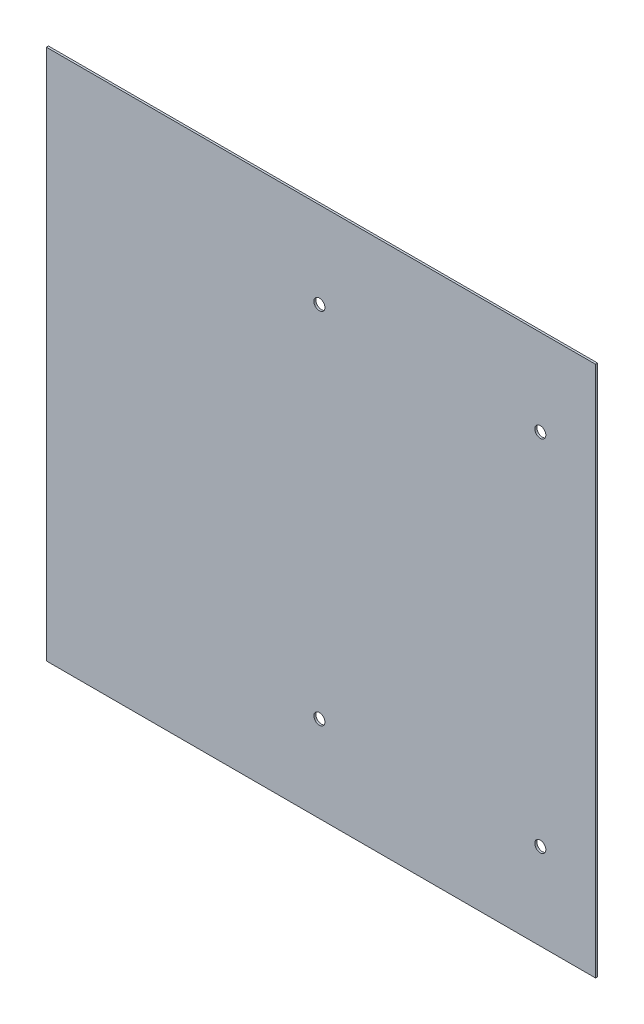
ISO-10303-21;
HEADER;
FILE_DESCRIPTION(('STEP AP214'),'2;1');
FILE_NAME('part.step','',(''),(''),'','','');
FILE_SCHEMA(('AUTOMOTIVE_DESIGN { 1 0 10303 214 1 1 1 1 }'));
ENDSEC;
DATA;
#1=APPLICATION_CONTEXT('core data for automotive mechanical design processes');
#2=APPLICATION_PROTOCOL_DEFINITION('international standard','automotive_design',2000,#1);
#3=PRODUCT_CONTEXT('',#1,'mechanical');
#4=PRODUCT('Part','Part','',(#3));
#5=PRODUCT_RELATED_PRODUCT_CATEGORY('part','',(#4));
#6=PRODUCT_DEFINITION_FORMATION('','',#4);
#7=PRODUCT_DEFINITION_CONTEXT('part definition',#1,'design');
#8=PRODUCT_DEFINITION('design','',#6,#7);
#9=PRODUCT_DEFINITION_SHAPE('','',#8);
#10=(LENGTH_UNIT() NAMED_UNIT(*) SI_UNIT(.MILLI.,.METRE.));
#11=(NAMED_UNIT(*) PLANE_ANGLE_UNIT() SI_UNIT($,.RADIAN.));
#12=(NAMED_UNIT(*) SI_UNIT($,.STERADIAN.) SOLID_ANGLE_UNIT());
#13=UNCERTAINTY_MEASURE_WITH_UNIT(LENGTH_MEASURE(1.E-05),#10,'distance_accuracy_value','');
#14=(GEOMETRIC_REPRESENTATION_CONTEXT(3) GLOBAL_UNCERTAINTY_ASSIGNED_CONTEXT((#13)) GLOBAL_UNIT_ASSIGNED_CONTEXT((#10,
#11,#12)) REPRESENTATION_CONTEXT('',''));
#15=CARTESIAN_POINT('',(0.,0.,0.));
#16=DIRECTION('',(0.,0.,1.));
#17=DIRECTION('',(1.,0.,0.));
#18=AXIS2_PLACEMENT_3D('',#15,#16,#17);
#19=CARTESIAN_POINT('',(231.071313833518,0.,1.5));
#20=DIRECTION('',(1.,0.,0.));
#21=DIRECTION('',(0.,0.,-1.));
#22=AXIS2_PLACEMENT_3D('',#19,#20,#21);
#23=PLANE('',#22);
#24=DIRECTION('',(0.,-1.,0.));
#25=VECTOR('',#24,1.);
#26=CARTESIAN_POINT('',(231.071313833518,0.,0.));
#27=LINE('',#26,#25);
#28=CARTESIAN_POINT('',(231.071313833518,0.,0.));
#29=VERTEX_POINT('',#28);
#30=CARTESIAN_POINT('',(231.071313833518,-385.,0.));
#31=VERTEX_POINT('',#30);
#32=EDGE_CURVE('E95',#29,#31,#27,.T.);
#33=ORIENTED_EDGE('',*,*,#32,.T.);
#34=DIRECTION('',(0.,0.,-1.));
#35=VECTOR('',#34,1.);
#36=CARTESIAN_POINT('',(231.071313833518,-385.,1.5));
#37=LINE('',#36,#35);
#38=CARTESIAN_POINT('',(231.071313833518,-385.,1.5));
#39=VERTEX_POINT('',#38);
#40=EDGE_CURVE('E11',#39,#31,#37,.T.);
#41=ORIENTED_EDGE('',*,*,#40,.F.);
#42=DIRECTION('',(0.,-1.,0.));
#43=VECTOR('',#42,1.);
#44=CARTESIAN_POINT('',(231.071313833518,0.,1.5));
#45=LINE('',#44,#43);
#46=CARTESIAN_POINT('',(231.071313833518,0.,1.5));
#47=VERTEX_POINT('',#46);
#48=EDGE_CURVE('E83',#47,#39,#45,.T.);
#49=ORIENTED_EDGE('',*,*,#48,.F.);
#50=DIRECTION('',(0.,0.,-1.));
#51=VECTOR('',#50,1.);
#52=CARTESIAN_POINT('',(231.071313833518,0.,1.5));
#53=LINE('',#52,#51);
#54=EDGE_CURVE('E91',#47,#29,#53,.T.);
#55=ORIENTED_EDGE('',*,*,#54,.T.);
#56=EDGE_LOOP('',(#33,#41,#49,#55));
#57=FACE_BOUND('',#56,.T.);
#58=ADVANCED_FACE('F32',(#57),#23,.F.);
#59=CARTESIAN_POINT('',(231.071313833518,-385.,1.5));
#60=DIRECTION('',(0.,1.,0.));
#61=DIRECTION('',(0.,0.,1.));
#62=AXIS2_PLACEMENT_3D('',#59,#60,#61);
#63=PLANE('',#62);
#64=DIRECTION('',(1.,0.,0.));
#65=VECTOR('',#64,1.);
#66=CARTESIAN_POINT('',(231.071313833518,-385.,0.));
#67=LINE('',#66,#65);
#68=CARTESIAN_POINT('',(628.8,-385.,0.));
#69=VERTEX_POINT('',#68);
#70=EDGE_CURVE('E87',#31,#69,#67,.T.);
#71=ORIENTED_EDGE('',*,*,#70,.T.);
#72=DIRECTION('',(0.,0.,-1.));
#73=VECTOR('',#72,1.);
#74=CARTESIAN_POINT('',(628.8,-385.,1.5));
#75=LINE('',#74,#73);
#76=CARTESIAN_POINT('',(628.8,-385.,1.5));
#77=VERTEX_POINT('',#76);
#78=EDGE_CURVE('E40',#77,#69,#75,.T.);
#79=ORIENTED_EDGE('',*,*,#78,.F.);
#80=DIRECTION('',(1.,0.,0.));
#81=VECTOR('',#80,1.);
#82=CARTESIAN_POINT('',(231.071313833518,-385.,1.5));
#83=LINE('',#82,#81);
#84=EDGE_CURVE('E78',#39,#77,#83,.T.);
#85=ORIENTED_EDGE('',*,*,#84,.F.);
#86=ORIENTED_EDGE('',*,*,#40,.T.);
#87=EDGE_LOOP('',(#71,#79,#85,#86));
#88=FACE_BOUND('',#87,.T.);
#89=ADVANCED_FACE('F86',(#88),#63,.F.);
#90=CARTESIAN_POINT('',(628.8,0.,1.5));
#91=DIRECTION('',(-1.,0.,0.));
#92=DIRECTION('',(0.,0.,1.));
#93=AXIS2_PLACEMENT_3D('',#90,#91,#92);
#94=PLANE('',#93);
#95=DIRECTION('',(0.,1.,0.));
#96=VECTOR('',#95,1.);
#97=CARTESIAN_POINT('',(628.8,0.,0.));
#98=LINE('',#97,#96);
#99=CARTESIAN_POINT('',(628.8,0.,0.));
#100=VERTEX_POINT('',#99);
#101=EDGE_CURVE('E65',#69,#100,#98,.T.);
#102=ORIENTED_EDGE('',*,*,#101,.T.);
#103=DIRECTION('',(0.,0.,-1.));
#104=VECTOR('',#103,1.);
#105=CARTESIAN_POINT('',(628.8,0.,1.5));
#106=LINE('',#105,#104);
#107=CARTESIAN_POINT('',(628.8,0.,1.5));
#108=VERTEX_POINT('',#107);
#109=EDGE_CURVE('E88',#108,#100,#106,.T.);
#110=ORIENTED_EDGE('',*,*,#109,.F.);
#111=DIRECTION('',(0.,1.,0.));
#112=VECTOR('',#111,1.);
#113=CARTESIAN_POINT('',(628.8,0.,1.5));
#114=LINE('',#113,#112);
#115=EDGE_CURVE('E81',#77,#108,#114,.T.);
#116=ORIENTED_EDGE('',*,*,#115,.F.);
#117=ORIENTED_EDGE('',*,*,#78,.T.);
#118=EDGE_LOOP('',(#102,#110,#116,#117));
#119=FACE_BOUND('',#118,.T.);
#120=ADVANCED_FACE('F89',(#119),#94,.F.);
#121=CARTESIAN_POINT('',(231.071313833518,0.,1.5));
#122=DIRECTION('',(0.,-1.,0.));
#123=DIRECTION('',(0.,0.,-1.));
#124=AXIS2_PLACEMENT_3D('',#121,#122,#123);
#125=PLANE('',#124);
#126=DIRECTION('',(-1.,0.,0.));
#127=VECTOR('',#126,1.);
#128=CARTESIAN_POINT('',(231.071313833518,0.,0.));
#129=LINE('',#128,#127);
#130=EDGE_CURVE('E71',#100,#29,#129,.T.);
#131=ORIENTED_EDGE('',*,*,#130,.T.);
#132=ORIENTED_EDGE('',*,*,#54,.F.);
#133=DIRECTION('',(-1.,0.,0.));
#134=VECTOR('',#133,1.);
#135=CARTESIAN_POINT('',(231.071313833518,0.,1.5));
#136=LINE('',#135,#134);
#137=EDGE_CURVE('E48',#108,#47,#136,.T.);
#138=ORIENTED_EDGE('',*,*,#137,.F.);
#139=ORIENTED_EDGE('',*,*,#109,.T.);
#140=EDGE_LOOP('',(#131,#132,#138,#139));
#141=FACE_BOUND('',#140,.T.);
#142=ADVANCED_FACE('F103',(#141),#125,.F.);
#143=CARTESIAN_POINT('',(0.,0.,1.5));
#144=DIRECTION('',(0.,0.,1.));
#145=DIRECTION('',(1.,0.,0.));
#146=AXIS2_PLACEMENT_3D('',#143,#144,#145);
#147=PLANE('',#146);
#148=CARTESIAN_POINT('',(588.8,-322.5,1.5));
#149=DIRECTION('',(0.,0.,1.));
#150=DIRECTION('',(-1.,0.,0.));
#151=AXIS2_PLACEMENT_3D('',#148,#149,#150);
#152=CIRCLE('',#151,3.99999999999999);
#153=CARTESIAN_POINT('',(584.8,-322.5,1.5));
#154=VERTEX_POINT('',#153);
#155=EDGE_CURVE('E122',#154,#154,#152,.T.);
#156=ORIENTED_EDGE('',*,*,#155,.F.);
#157=EDGE_LOOP('',(#156));
#158=FACE_BOUND('',#157,.T.);
#159=CARTESIAN_POINT('',(428.8,-62.5000000000002,1.5));
#160=DIRECTION('',(0.,0.,1.));
#161=DIRECTION('',(-1.,0.,0.));
#162=AXIS2_PLACEMENT_3D('',#159,#160,#161);
#163=CIRCLE('',#162,4.0000000000001);
#164=CARTESIAN_POINT('',(424.8,-62.5000000000002,1.5));
#165=VERTEX_POINT('',#164);
#166=EDGE_CURVE('E115',#165,#165,#163,.T.);
#167=ORIENTED_EDGE('',*,*,#166,.F.);
#168=EDGE_LOOP('',(#167));
#169=FACE_BOUND('',#168,.T.);
#170=CARTESIAN_POINT('',(428.8,-322.5,1.5));
#171=DIRECTION('',(0.,0.,1.));
#172=DIRECTION('',(1.,0.,0.));
#173=AXIS2_PLACEMENT_3D('',#170,#171,#172);
#174=CIRCLE('',#173,4.0000000000001);
#175=CARTESIAN_POINT('',(432.8,-322.5,1.5));
#176=VERTEX_POINT('',#175);
#177=EDGE_CURVE('E127',#176,#176,#174,.T.);
#178=ORIENTED_EDGE('',*,*,#177,.F.);
#179=EDGE_LOOP('',(#178));
#180=FACE_BOUND('',#179,.T.);
#181=CARTESIAN_POINT('',(588.8,-62.5000000000002,1.5));
#182=DIRECTION('',(0.,0.,1.));
#183=DIRECTION('',(1.,0.,0.));
#184=AXIS2_PLACEMENT_3D('',#181,#182,#183);
#185=CIRCLE('',#184,3.99999999999999);
#186=CARTESIAN_POINT('',(592.8,-62.5000000000002,1.5));
#187=VERTEX_POINT('',#186);
#188=EDGE_CURVE('E109',#187,#187,#185,.T.);
#189=ORIENTED_EDGE('',*,*,#188,.F.);
#190=EDGE_LOOP('',(#189));
#191=FACE_BOUND('',#190,.T.);
#192=ORIENTED_EDGE('',*,*,#48,.T.);
#193=ORIENTED_EDGE('',*,*,#84,.T.);
#194=ORIENTED_EDGE('',*,*,#115,.T.);
#195=ORIENTED_EDGE('',*,*,#137,.T.);
#196=EDGE_LOOP('',(#192,#193,#194,#195));
#197=FACE_BOUND('',#196,.T.);
#198=ADVANCED_FACE('F79',(#158,#169,#180,#191,#197),#147,.T.);
#199=CARTESIAN_POINT('',(0.,0.,0.));
#200=DIRECTION('',(0.,0.,1.));
#201=DIRECTION('',(1.,0.,0.));
#202=AXIS2_PLACEMENT_3D('',#199,#200,#201);
#203=PLANE('',#202);
#204=CARTESIAN_POINT('',(588.8,-322.5,0.));
#205=DIRECTION('',(0.,0.,1.));
#206=DIRECTION('',(-1.,0.,0.));
#207=AXIS2_PLACEMENT_3D('',#204,#205,#206);
#208=CIRCLE('',#207,3.99999999999999);
#209=CARTESIAN_POINT('',(584.8,-322.5,0.));
#210=VERTEX_POINT('',#209);
#211=EDGE_CURVE('E112',#210,#210,#208,.T.);
#212=ORIENTED_EDGE('',*,*,#211,.T.);
#213=EDGE_LOOP('',(#212));
#214=FACE_BOUND('',#213,.T.);
#215=CARTESIAN_POINT('',(428.8,-62.5000000000002,0.));
#216=DIRECTION('',(0.,0.,1.));
#217=DIRECTION('',(-1.,0.,0.));
#218=AXIS2_PLACEMENT_3D('',#215,#216,#217);
#219=CIRCLE('',#218,4.0000000000001);
#220=CARTESIAN_POINT('',(424.8,-62.5000000000002,0.));
#221=VERTEX_POINT('',#220);
#222=EDGE_CURVE('E118',#221,#221,#219,.T.);
#223=ORIENTED_EDGE('',*,*,#222,.T.);
#224=EDGE_LOOP('',(#223));
#225=FACE_BOUND('',#224,.T.);
#226=CARTESIAN_POINT('',(428.8,-322.5,0.));
#227=DIRECTION('',(0.,0.,1.));
#228=DIRECTION('',(1.,0.,0.));
#229=AXIS2_PLACEMENT_3D('',#226,#227,#228);
#230=CIRCLE('',#229,4.0000000000001);
#231=CARTESIAN_POINT('',(432.8,-322.5,0.));
#232=VERTEX_POINT('',#231);
#233=EDGE_CURVE('E119',#232,#232,#230,.T.);
#234=ORIENTED_EDGE('',*,*,#233,.T.);
#235=EDGE_LOOP('',(#234));
#236=FACE_BOUND('',#235,.T.);
#237=CARTESIAN_POINT('',(588.8,-62.5000000000002,0.));
#238=DIRECTION('',(0.,0.,1.));
#239=DIRECTION('',(1.,0.,0.));
#240=AXIS2_PLACEMENT_3D('',#237,#238,#239);
#241=CIRCLE('',#240,3.99999999999999);
#242=CARTESIAN_POINT('',(592.8,-62.5000000000002,0.));
#243=VERTEX_POINT('',#242);
#244=EDGE_CURVE('E98',#243,#243,#241,.T.);
#245=ORIENTED_EDGE('',*,*,#244,.T.);
#246=EDGE_LOOP('',(#245));
#247=FACE_BOUND('',#246,.T.);
#248=ORIENTED_EDGE('',*,*,#32,.F.);
#249=ORIENTED_EDGE('',*,*,#130,.F.);
#250=ORIENTED_EDGE('',*,*,#101,.F.);
#251=ORIENTED_EDGE('',*,*,#70,.F.);
#252=EDGE_LOOP('',(#248,#249,#250,#251));
#253=FACE_BOUND('',#252,.T.);
#254=ADVANCED_FACE('F106',(#214,#225,#236,#247,#253),#203,.F.);
#255=CARTESIAN_POINT('',(588.8,-62.5000000000002,0.));
#256=DIRECTION('',(0.,0.,1.));
#257=DIRECTION('',(1.,0.,0.));
#258=AXIS2_PLACEMENT_3D('',#255,#256,#257);
#259=CYLINDRICAL_SURFACE('',#258,3.99999999999999);
#260=ORIENTED_EDGE('',*,*,#244,.F.);
#261=EDGE_LOOP('',(#260));
#262=FACE_BOUND('',#261,.T.);
#263=ORIENTED_EDGE('',*,*,#188,.T.);
#264=EDGE_LOOP('',(#263));
#265=FACE_BOUND('',#264,.T.);
#266=ADVANCED_FACE('F139',(#262,#265),#259,.F.);
#267=CARTESIAN_POINT('',(428.8,-322.5,0.));
#268=DIRECTION('',(0.,0.,1.));
#269=DIRECTION('',(1.,0.,0.));
#270=AXIS2_PLACEMENT_3D('',#267,#268,#269);
#271=CYLINDRICAL_SURFACE('',#270,4.0000000000001);
#272=ORIENTED_EDGE('',*,*,#233,.F.);
#273=EDGE_LOOP('',(#272));
#274=FACE_BOUND('',#273,.T.);
#275=ORIENTED_EDGE('',*,*,#177,.T.);
#276=EDGE_LOOP('',(#275));
#277=FACE_BOUND('',#276,.T.);
#278=ADVANCED_FACE('F135',(#274,#277),#271,.F.);
#279=CARTESIAN_POINT('',(428.8,-62.5000000000002,0.));
#280=DIRECTION('',(0.,0.,1.));
#281=DIRECTION('',(1.,0.,0.));
#282=AXIS2_PLACEMENT_3D('',#279,#280,#281);
#283=CYLINDRICAL_SURFACE('',#282,4.0000000000001);
#284=ORIENTED_EDGE('',*,*,#222,.F.);
#285=EDGE_LOOP('',(#284));
#286=FACE_BOUND('',#285,.T.);
#287=ORIENTED_EDGE('',*,*,#166,.T.);
#288=EDGE_LOOP('',(#287));
#289=FACE_BOUND('',#288,.T.);
#290=ADVANCED_FACE('F138',(#286,#289),#283,.F.);
#291=CARTESIAN_POINT('',(588.8,-322.5,0.));
#292=DIRECTION('',(0.,0.,1.));
#293=DIRECTION('',(1.,0.,0.));
#294=AXIS2_PLACEMENT_3D('',#291,#292,#293);
#295=CYLINDRICAL_SURFACE('',#294,3.99999999999999);
#296=ORIENTED_EDGE('',*,*,#211,.F.);
#297=EDGE_LOOP('',(#296));
#298=FACE_BOUND('',#297,.T.);
#299=ORIENTED_EDGE('',*,*,#155,.T.);
#300=EDGE_LOOP('',(#299));
#301=FACE_BOUND('',#300,.T.);
#302=ADVANCED_FACE('F200',(#298,#301),#295,.F.);
#303=CLOSED_SHELL('',(#58,#89,#120,#142,#198,#254,#266,#278,#290,#302));
#304=MANIFOLD_SOLID_BREP('B2',#303);
#305=ADVANCED_BREP_SHAPE_REPRESENTATION('',(#18,#304),#14);
#306=SHAPE_DEFINITION_REPRESENTATION(#9,#305);
ENDSEC;
END-ISO-10303-21;
